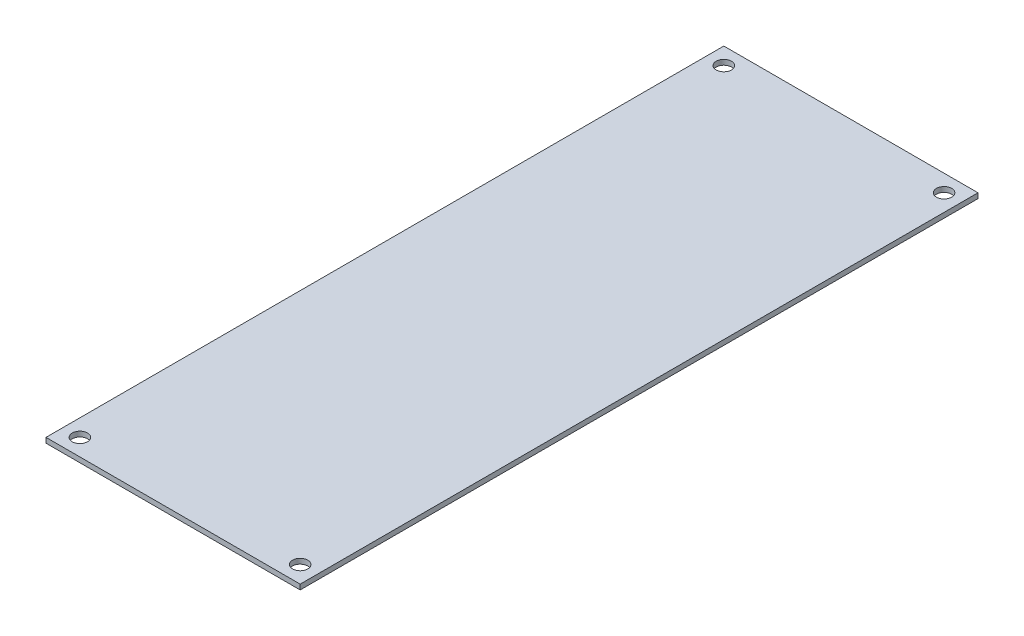
ISO-10303-21;
HEADER;
FILE_DESCRIPTION(('STEP AP214'),'2;1');
FILE_NAME('part.step','',(''),(''),'','','');
FILE_SCHEMA(('AUTOMOTIVE_DESIGN { 1 0 10303 214 1 1 1 1 }'));
ENDSEC;
DATA;
#1=APPLICATION_CONTEXT('core data for automotive mechanical design processes');
#2=APPLICATION_PROTOCOL_DEFINITION('international standard','automotive_design',2000,#1);
#3=PRODUCT_CONTEXT('',#1,'mechanical');
#4=PRODUCT('Part','Part','',(#3));
#5=PRODUCT_RELATED_PRODUCT_CATEGORY('part','',(#4));
#6=PRODUCT_DEFINITION_FORMATION('','',#4);
#7=PRODUCT_DEFINITION_CONTEXT('part definition',#1,'design');
#8=PRODUCT_DEFINITION('design','',#6,#7);
#9=PRODUCT_DEFINITION_SHAPE('','',#8);
#10=(LENGTH_UNIT() NAMED_UNIT(*) SI_UNIT(.MILLI.,.METRE.));
#11=(NAMED_UNIT(*) PLANE_ANGLE_UNIT() SI_UNIT($,.RADIAN.));
#12=(NAMED_UNIT(*) SI_UNIT($,.STERADIAN.) SOLID_ANGLE_UNIT());
#13=UNCERTAINTY_MEASURE_WITH_UNIT(LENGTH_MEASURE(1.E-05),#10,'distance_accuracy_value','');
#14=(GEOMETRIC_REPRESENTATION_CONTEXT(3) GLOBAL_UNCERTAINTY_ASSIGNED_CONTEXT((#13)) GLOBAL_UNIT_ASSIGNED_CONTEXT((#10,
#11,#12)) REPRESENTATION_CONTEXT('',''));
#15=CARTESIAN_POINT('',(0.,0.,0.));
#16=DIRECTION('',(0.,0.,1.));
#17=DIRECTION('',(1.,0.,0.));
#18=AXIS2_PLACEMENT_3D('',#15,#16,#17);
#19=CARTESIAN_POINT('',(0.,0.75,-200.));
#20=DIRECTION('',(1.,0.,0.));
#21=DIRECTION('',(0.,0.,-1.));
#22=AXIS2_PLACEMENT_3D('',#19,#20,#21);
#23=PLANE('',#22);
#24=DIRECTION('',(0.,0.,1.));
#25=VECTOR('',#24,1.);
#26=CARTESIAN_POINT('',(0.,-0.75,-200.));
#27=LINE('',#26,#25);
#28=CARTESIAN_POINT('',(0.,-0.75,-200.));
#29=VERTEX_POINT('',#28);
#30=CARTESIAN_POINT('',(0.,-0.75,0.));
#31=VERTEX_POINT('',#30);
#32=EDGE_CURVE('E100',#29,#31,#27,.T.);
#33=ORIENTED_EDGE('',*,*,#32,.T.);
#34=DIRECTION('',(0.,-1.,0.));
#35=VECTOR('',#34,1.);
#36=CARTESIAN_POINT('',(0.,0.75,0.));
#37=LINE('',#36,#35);
#38=CARTESIAN_POINT('',(0.,0.75,0.));
#39=VERTEX_POINT('',#38);
#40=EDGE_CURVE('E11',#39,#31,#37,.T.);
#41=ORIENTED_EDGE('',*,*,#40,.F.);
#42=DIRECTION('',(0.,0.,1.));
#43=VECTOR('',#42,1.);
#44=CARTESIAN_POINT('',(0.,0.75,-200.));
#45=LINE('',#44,#43);
#46=CARTESIAN_POINT('',(0.,0.75,-200.));
#47=VERTEX_POINT('',#46);
#48=EDGE_CURVE('E88',#47,#39,#45,.T.);
#49=ORIENTED_EDGE('',*,*,#48,.F.);
#50=DIRECTION('',(0.,-1.,0.));
#51=VECTOR('',#50,1.);
#52=CARTESIAN_POINT('',(0.,0.75,-200.));
#53=LINE('',#52,#51);
#54=EDGE_CURVE('E96',#47,#29,#53,.T.);
#55=ORIENTED_EDGE('',*,*,#54,.T.);
#56=EDGE_LOOP('',(#33,#41,#49,#55));
#57=FACE_BOUND('',#56,.T.);
#58=ADVANCED_FACE('F37',(#57),#23,.F.);
#59=CARTESIAN_POINT('',(0.,0.75,0.));
#60=DIRECTION('',(0.,0.,-1.));
#61=DIRECTION('',(-1.,0.,0.));
#62=AXIS2_PLACEMENT_3D('',#59,#60,#61);
#63=PLANE('',#62);
#64=DIRECTION('',(1.,0.,0.));
#65=VECTOR('',#64,1.);
#66=CARTESIAN_POINT('',(0.,-0.75,0.));
#67=LINE('',#66,#65);
#68=CARTESIAN_POINT('',(75.,-0.75,0.));
#69=VERTEX_POINT('',#68);
#70=EDGE_CURVE('E92',#31,#69,#67,.T.);
#71=ORIENTED_EDGE('',*,*,#70,.T.);
#72=DIRECTION('',(0.,-1.,0.));
#73=VECTOR('',#72,1.);
#74=CARTESIAN_POINT('',(75.,0.75,0.));
#75=LINE('',#74,#73);
#76=CARTESIAN_POINT('',(75.,0.75,0.));
#77=VERTEX_POINT('',#76);
#78=EDGE_CURVE('E45',#77,#69,#75,.T.);
#79=ORIENTED_EDGE('',*,*,#78,.F.);
#80=DIRECTION('',(1.,0.,0.));
#81=VECTOR('',#80,1.);
#82=CARTESIAN_POINT('',(0.,0.75,0.));
#83=LINE('',#82,#81);
#84=EDGE_CURVE('E83',#39,#77,#83,.T.);
#85=ORIENTED_EDGE('',*,*,#84,.F.);
#86=ORIENTED_EDGE('',*,*,#40,.T.);
#87=EDGE_LOOP('',(#71,#79,#85,#86));
#88=FACE_BOUND('',#87,.T.);
#89=ADVANCED_FACE('F91',(#88),#63,.F.);
#90=CARTESIAN_POINT('',(75.,0.75,0.));
#91=DIRECTION('',(-1.,0.,0.));
#92=DIRECTION('',(0.,0.,1.));
#93=AXIS2_PLACEMENT_3D('',#90,#91,#92);
#94=PLANE('',#93);
#95=DIRECTION('',(0.,0.,-1.));
#96=VECTOR('',#95,1.);
#97=CARTESIAN_POINT('',(75.,-0.75,0.));
#98=LINE('',#97,#96);
#99=CARTESIAN_POINT('',(74.9999999999999,-0.75,-200.));
#100=VERTEX_POINT('',#99);
#101=EDGE_CURVE('E70',#69,#100,#98,.T.);
#102=ORIENTED_EDGE('',*,*,#101,.T.);
#103=DIRECTION('',(0.,-1.,0.));
#104=VECTOR('',#103,1.);
#105=CARTESIAN_POINT('',(74.9999999999999,0.75,-200.));
#106=LINE('',#105,#104);
#107=CARTESIAN_POINT('',(74.9999999999999,0.75,-200.));
#108=VERTEX_POINT('',#107);
#109=EDGE_CURVE('E93',#108,#100,#106,.T.);
#110=ORIENTED_EDGE('',*,*,#109,.F.);
#111=DIRECTION('',(0.,0.,-1.));
#112=VECTOR('',#111,1.);
#113=CARTESIAN_POINT('',(75.,0.75,0.));
#114=LINE('',#113,#112);
#115=EDGE_CURVE('E86',#77,#108,#114,.T.);
#116=ORIENTED_EDGE('',*,*,#115,.F.);
#117=ORIENTED_EDGE('',*,*,#78,.T.);
#118=EDGE_LOOP('',(#102,#110,#116,#117));
#119=FACE_BOUND('',#118,.T.);
#120=ADVANCED_FACE('F94',(#119),#94,.F.);
#121=CARTESIAN_POINT('',(74.9999999999999,0.75,-200.));
#122=DIRECTION('',(0.,0.,1.));
#123=DIRECTION('',(1.,0.,0.));
#124=AXIS2_PLACEMENT_3D('',#121,#122,#123);
#125=PLANE('',#124);
#126=DIRECTION('',(-1.,0.,0.));
#127=VECTOR('',#126,1.);
#128=CARTESIAN_POINT('',(74.9999999999999,-0.75,-200.));
#129=LINE('',#128,#127);
#130=EDGE_CURVE('E76',#100,#29,#129,.T.);
#131=ORIENTED_EDGE('',*,*,#130,.T.);
#132=ORIENTED_EDGE('',*,*,#54,.F.);
#133=DIRECTION('',(-1.,0.,0.));
#134=VECTOR('',#133,1.);
#135=CARTESIAN_POINT('',(74.9999999999999,0.75,-200.));
#136=LINE('',#135,#134);
#137=EDGE_CURVE('E53',#108,#47,#136,.T.);
#138=ORIENTED_EDGE('',*,*,#137,.F.);
#139=ORIENTED_EDGE('',*,*,#109,.T.);
#140=EDGE_LOOP('',(#131,#132,#138,#139));
#141=FACE_BOUND('',#140,.T.);
#142=ADVANCED_FACE('F108',(#141),#125,.F.);
#143=CARTESIAN_POINT('',(0.,0.75,0.));
#144=DIRECTION('',(0.,1.,0.));
#145=DIRECTION('',(0.,0.,1.));
#146=AXIS2_PLACEMENT_3D('',#143,#144,#145);
#147=PLANE('',#146);
#148=CARTESIAN_POINT('',(70.,0.75,-195.));
#149=DIRECTION('',(0.,1.,0.));
#150=DIRECTION('',(0.,0.,1.));
#151=AXIS2_PLACEMENT_3D('',#148,#149,#150);
#152=CIRCLE('',#151,2.25);
#153=CARTESIAN_POINT('',(70.,0.75,-192.75));
#154=VERTEX_POINT('',#153);
#155=EDGE_CURVE('E103',#154,#154,#152,.T.);
#156=ORIENTED_EDGE('',*,*,#155,.F.);
#157=EDGE_LOOP('',(#156));
#158=FACE_BOUND('',#157,.T.);
#159=CARTESIAN_POINT('',(5.,0.75,-5.));
#160=DIRECTION('',(0.,1.,0.));
#161=DIRECTION('',(0.,0.,1.));
#162=AXIS2_PLACEMENT_3D('',#159,#160,#161);
#163=CIRCLE('',#162,2.25);
#164=CARTESIAN_POINT('',(5.,0.75,-2.75));
#165=VERTEX_POINT('',#164);
#166=EDGE_CURVE('E116',#165,#165,#163,.T.);
#167=ORIENTED_EDGE('',*,*,#166,.F.);
#168=EDGE_LOOP('',(#167));
#169=FACE_BOUND('',#168,.T.);
#170=CARTESIAN_POINT('',(70.,0.75,-5.));
#171=DIRECTION('',(0.,1.,0.));
#172=DIRECTION('',(0.,0.,1.));
#173=AXIS2_PLACEMENT_3D('',#170,#171,#172);
#174=CIRCLE('',#173,2.25);
#175=CARTESIAN_POINT('',(70.,0.75,-2.75));
#176=VERTEX_POINT('',#175);
#177=EDGE_CURVE('E119',#176,#176,#174,.T.);
#178=ORIENTED_EDGE('',*,*,#177,.F.);
#179=EDGE_LOOP('',(#178));
#180=FACE_BOUND('',#179,.T.);
#181=CARTESIAN_POINT('',(5.,0.75,-195.));
#182=DIRECTION('',(0.,1.,0.));
#183=DIRECTION('',(0.,0.,1.));
#184=AXIS2_PLACEMENT_3D('',#181,#182,#183);
#185=CIRCLE('',#184,2.25);
#186=CARTESIAN_POINT('',(5.,0.75,-192.75));
#187=VERTEX_POINT('',#186);
#188=EDGE_CURVE('E122',#187,#187,#185,.T.);
#189=ORIENTED_EDGE('',*,*,#188,.F.);
#190=EDGE_LOOP('',(#189));
#191=FACE_BOUND('',#190,.T.);
#192=ORIENTED_EDGE('',*,*,#48,.T.);
#193=ORIENTED_EDGE('',*,*,#84,.T.);
#194=ORIENTED_EDGE('',*,*,#115,.T.);
#195=ORIENTED_EDGE('',*,*,#137,.T.);
#196=EDGE_LOOP('',(#192,#193,#194,#195));
#197=FACE_BOUND('',#196,.T.);
#198=ADVANCED_FACE('F84',(#158,#169,#180,#191,#197),#147,.T.);
#199=CARTESIAN_POINT('',(0.,-0.75,0.));
#200=DIRECTION('',(0.,1.,0.));
#201=DIRECTION('',(0.,0.,1.));
#202=AXIS2_PLACEMENT_3D('',#199,#200,#201);
#203=PLANE('',#202);
#204=CARTESIAN_POINT('',(70.,-0.75,-195.));
#205=DIRECTION('',(0.,1.,0.));
#206=DIRECTION('',(0.,0.,1.));
#207=AXIS2_PLACEMENT_3D('',#204,#205,#206);
#208=CIRCLE('',#207,2.25);
#209=CARTESIAN_POINT('',(70.,-0.75,-192.75));
#210=VERTEX_POINT('',#209);
#211=EDGE_CURVE('E128',#210,#210,#208,.T.);
#212=ORIENTED_EDGE('',*,*,#211,.T.);
#213=EDGE_LOOP('',(#212));
#214=FACE_BOUND('',#213,.T.);
#215=CARTESIAN_POINT('',(5.,-0.75,-5.));
#216=DIRECTION('',(0.,1.,0.));
#217=DIRECTION('',(0.,0.,1.));
#218=AXIS2_PLACEMENT_3D('',#215,#216,#217);
#219=CIRCLE('',#218,2.25);
#220=CARTESIAN_POINT('',(5.,-0.75,-2.75));
#221=VERTEX_POINT('',#220);
#222=EDGE_CURVE('E129',#221,#221,#219,.T.);
#223=ORIENTED_EDGE('',*,*,#222,.T.);
#224=EDGE_LOOP('',(#223));
#225=FACE_BOUND('',#224,.T.);
#226=CARTESIAN_POINT('',(70.,-0.75,-5.));
#227=DIRECTION('',(0.,1.,0.));
#228=DIRECTION('',(0.,0.,1.));
#229=AXIS2_PLACEMENT_3D('',#226,#227,#228);
#230=CIRCLE('',#229,2.25);
#231=CARTESIAN_POINT('',(70.,-0.75,-2.75));
#232=VERTEX_POINT('',#231);
#233=EDGE_CURVE('E132',#232,#232,#230,.T.);
#234=ORIENTED_EDGE('',*,*,#233,.T.);
#235=EDGE_LOOP('',(#234));
#236=FACE_BOUND('',#235,.T.);
#237=CARTESIAN_POINT('',(5.,-0.75,-195.));
#238=DIRECTION('',(0.,1.,0.));
#239=DIRECTION('',(0.,0.,1.));
#240=AXIS2_PLACEMENT_3D('',#237,#238,#239);
#241=CIRCLE('',#240,2.25);
#242=CARTESIAN_POINT('',(5.,-0.75,-192.75));
#243=VERTEX_POINT('',#242);
#244=EDGE_CURVE('E125',#243,#243,#241,.T.);
#245=ORIENTED_EDGE('',*,*,#244,.T.);
#246=EDGE_LOOP('',(#245));
#247=FACE_BOUND('',#246,.T.);
#248=ORIENTED_EDGE('',*,*,#32,.F.);
#249=ORIENTED_EDGE('',*,*,#130,.F.);
#250=ORIENTED_EDGE('',*,*,#101,.F.);
#251=ORIENTED_EDGE('',*,*,#70,.F.);
#252=EDGE_LOOP('',(#248,#249,#250,#251));
#253=FACE_BOUND('',#252,.T.);
#254=ADVANCED_FACE('F111',(#214,#225,#236,#247,#253),#203,.F.);
#255=CARTESIAN_POINT('',(5.,-0.75,-195.));
#256=DIRECTION('',(0.,1.,0.));
#257=DIRECTION('',(0.,0.,1.));
#258=AXIS2_PLACEMENT_3D('',#255,#256,#257);
#259=CYLINDRICAL_SURFACE('',#258,2.25);
#260=ORIENTED_EDGE('',*,*,#188,.T.);
#261=EDGE_LOOP('',(#260));
#262=FACE_BOUND('',#261,.T.);
#263=ORIENTED_EDGE('',*,*,#244,.F.);
#264=EDGE_LOOP('',(#263));
#265=FACE_BOUND('',#264,.T.);
#266=ADVANCED_FACE('F143',(#262,#265),#259,.F.);
#267=CARTESIAN_POINT('',(70.,-0.75,-5.));
#268=DIRECTION('',(0.,1.,0.));
#269=DIRECTION('',(0.,0.,1.));
#270=AXIS2_PLACEMENT_3D('',#267,#268,#269);
#271=CYLINDRICAL_SURFACE('',#270,2.25);
#272=ORIENTED_EDGE('',*,*,#177,.T.);
#273=EDGE_LOOP('',(#272));
#274=FACE_BOUND('',#273,.T.);
#275=ORIENTED_EDGE('',*,*,#233,.F.);
#276=EDGE_LOOP('',(#275));
#277=FACE_BOUND('',#276,.T.);
#278=ADVANCED_FACE('F140',(#274,#277),#271,.F.);
#279=CARTESIAN_POINT('',(5.,-0.75,-5.));
#280=DIRECTION('',(0.,1.,0.));
#281=DIRECTION('',(0.,0.,1.));
#282=AXIS2_PLACEMENT_3D('',#279,#280,#281);
#283=CYLINDRICAL_SURFACE('',#282,2.25);
#284=ORIENTED_EDGE('',*,*,#166,.T.);
#285=EDGE_LOOP('',(#284));
#286=FACE_BOUND('',#285,.T.);
#287=ORIENTED_EDGE('',*,*,#222,.F.);
#288=EDGE_LOOP('',(#287));
#289=FACE_BOUND('',#288,.T.);
#290=ADVANCED_FACE('F142',(#286,#289),#283,.F.);
#291=CARTESIAN_POINT('',(70.,-0.75,-195.));
#292=DIRECTION('',(0.,1.,0.));
#293=DIRECTION('',(0.,0.,1.));
#294=AXIS2_PLACEMENT_3D('',#291,#292,#293);
#295=CYLINDRICAL_SURFACE('',#294,2.25);
#296=ORIENTED_EDGE('',*,*,#155,.T.);
#297=EDGE_LOOP('',(#296));
#298=FACE_BOUND('',#297,.T.);
#299=ORIENTED_EDGE('',*,*,#211,.F.);
#300=EDGE_LOOP('',(#299));
#301=FACE_BOUND('',#300,.T.);
#302=ADVANCED_FACE('F150',(#298,#301),#295,.F.);
#303=CLOSED_SHELL('',(#58,#89,#120,#142,#198,#254,#266,#278,#290,#302));
#304=MANIFOLD_SOLID_BREP('B2',#303);
#305=ADVANCED_BREP_SHAPE_REPRESENTATION('',(#18,#304),#14);
#306=SHAPE_DEFINITION_REPRESENTATION(#9,#305);
ENDSEC;
END-ISO-10303-21;
